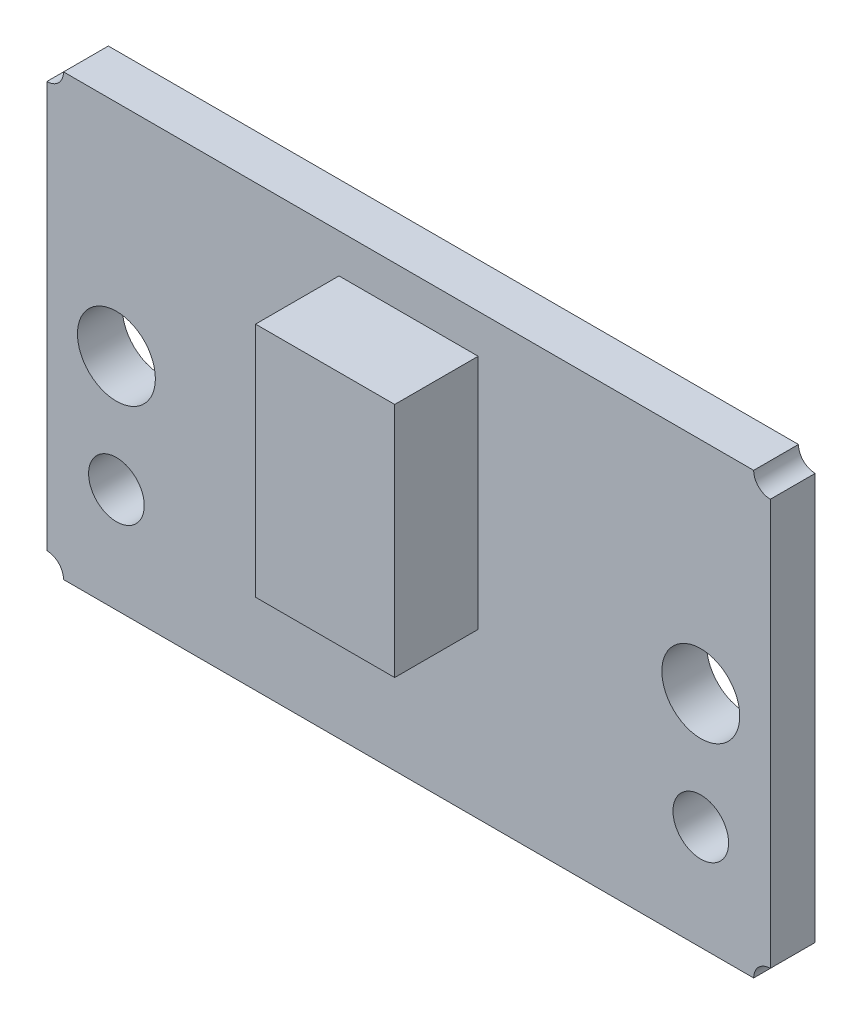
ISO-10303-21;
HEADER;
FILE_DESCRIPTION(('STEP AP214'),'2;1');
FILE_NAME('part.step','',(''),(''),'','','');
FILE_SCHEMA(('AUTOMOTIVE_DESIGN { 1 0 10303 214 1 1 1 1 }'));
ENDSEC;
DATA;
#1=APPLICATION_CONTEXT('core data for automotive mechanical design processes');
#2=APPLICATION_PROTOCOL_DEFINITION('international standard','automotive_design',2000,#1);
#3=PRODUCT_CONTEXT('',#1,'mechanical');
#4=PRODUCT('Part','Part','',(#3));
#5=PRODUCT_RELATED_PRODUCT_CATEGORY('part','',(#4));
#6=PRODUCT_DEFINITION_FORMATION('','',#4);
#7=PRODUCT_DEFINITION_CONTEXT('part definition',#1,'design');
#8=PRODUCT_DEFINITION('design','',#6,#7);
#9=PRODUCT_DEFINITION_SHAPE('','',#8);
#10=(LENGTH_UNIT() NAMED_UNIT(*) SI_UNIT(.MILLI.,.METRE.));
#11=(NAMED_UNIT(*) PLANE_ANGLE_UNIT() SI_UNIT($,.RADIAN.));
#12=(NAMED_UNIT(*) SI_UNIT($,.STERADIAN.) SOLID_ANGLE_UNIT());
#13=UNCERTAINTY_MEASURE_WITH_UNIT(LENGTH_MEASURE(1.E-05),#10,'distance_accuracy_value','');
#14=(GEOMETRIC_REPRESENTATION_CONTEXT(3) GLOBAL_UNCERTAINTY_ASSIGNED_CONTEXT((#13)) GLOBAL_UNIT_ASSIGNED_CONTEXT((#10,
#11,#12)) REPRESENTATION_CONTEXT('',''));
#15=CARTESIAN_POINT('',(0.,0.,0.));
#16=DIRECTION('',(0.,0.,1.));
#17=DIRECTION('',(1.,0.,0.));
#18=AXIS2_PLACEMENT_3D('',#15,#16,#17);
#19=CARTESIAN_POINT('',(0.,0.,1.61));
#20=DIRECTION('',(0.,0.,1.));
#21=DIRECTION('',(1.,0.,0.));
#22=AXIS2_PLACEMENT_3D('',#19,#20,#21);
#23=PLANE('',#22);
#24=CARTESIAN_POINT('',(10.5,0.,1.61));
#25=DIRECTION('',(0.,0.,1.));
#26=DIRECTION('',(1.,0.,0.));
#27=AXIS2_PLACEMENT_3D('',#24,#25,#26);
#28=CIRCLE('',#27,1.4);
#29=CARTESIAN_POINT('',(11.9,0.,1.61));
#30=VERTEX_POINT('',#29);
#31=EDGE_CURVE('E168',#30,#30,#28,.T.);
#32=ORIENTED_EDGE('',*,*,#31,.F.);
#33=EDGE_LOOP('',(#32));
#34=FACE_BOUND('',#33,.T.);
#35=CARTESIAN_POINT('',(-10.5,-4.15,1.61));
#36=DIRECTION('',(0.,0.,1.));
#37=DIRECTION('',(1.,0.,0.));
#38=AXIS2_PLACEMENT_3D('',#35,#36,#37);
#39=CIRCLE('',#38,1.);
#40=CARTESIAN_POINT('',(-9.5,-4.15,1.61));
#41=VERTEX_POINT('',#40);
#42=EDGE_CURVE('E163',#41,#41,#39,.T.);
#43=ORIENTED_EDGE('',*,*,#42,.F.);
#44=EDGE_LOOP('',(#43));
#45=FACE_BOUND('',#44,.T.);
#46=CARTESIAN_POINT('',(10.5,-4.15,1.61));
#47=DIRECTION('',(0.,0.,1.));
#48=DIRECTION('',(1.,0.,0.));
#49=AXIS2_PLACEMENT_3D('',#46,#47,#48);
#50=CIRCLE('',#49,1.);
#51=CARTESIAN_POINT('',(11.5,-4.15,1.61));
#52=VERTEX_POINT('',#51);
#53=EDGE_CURVE('E160',#52,#52,#50,.T.);
#54=ORIENTED_EDGE('',*,*,#53,.F.);
#55=EDGE_LOOP('',(#54));
#56=FACE_BOUND('',#55,.T.);
#57=CARTESIAN_POINT('',(-10.5,0.,1.61));
#58=DIRECTION('',(0.,0.,1.));
#59=DIRECTION('',(1.,0.,0.));
#60=AXIS2_PLACEMENT_3D('',#57,#58,#59);
#61=CIRCLE('',#60,1.4);
#62=CARTESIAN_POINT('',(-9.1,0.,1.61));
#63=VERTEX_POINT('',#62);
#64=EDGE_CURVE('E171',#63,#63,#61,.T.);
#65=ORIENTED_EDGE('',*,*,#64,.F.);
#66=EDGE_LOOP('',(#65));
#67=FACE_BOUND('',#66,.T.);
#68=CARTESIAN_POINT('',(13.,7.9,1.61));
#69=DIRECTION('',(0.,0.,1.));
#70=DIRECTION('',(1.,0.,0.));
#71=AXIS2_PLACEMENT_3D('',#68,#69,#70);
#72=CIRCLE('',#71,0.6);
#73=CARTESIAN_POINT('',(12.4,7.9,1.61));
#74=VERTEX_POINT('',#73);
#75=CARTESIAN_POINT('',(13.,7.3,1.61));
#76=VERTEX_POINT('',#75);
#77=EDGE_CURVE('E188',#74,#76,#72,.T.);
#78=ORIENTED_EDGE('',*,*,#77,.F.);
#79=DIRECTION('',(-1.,0.,0.));
#80=VECTOR('',#79,1.);
#81=CARTESIAN_POINT('',(-13.,7.9,1.61));
#82=LINE('',#81,#80);
#83=CARTESIAN_POINT('',(-12.4,7.9,1.61));
#84=VERTEX_POINT('',#83);
#85=EDGE_CURVE('E220',#74,#84,#82,.T.);
#86=ORIENTED_EDGE('',*,*,#85,.T.);
#87=CARTESIAN_POINT('',(-13.,7.9,1.61));
#88=DIRECTION('',(0.,0.,1.));
#89=DIRECTION('',(1.,0.,0.));
#90=AXIS2_PLACEMENT_3D('',#87,#88,#89);
#91=CIRCLE('',#90,0.6);
#92=CARTESIAN_POINT('',(-13.,7.3,1.61));
#93=VERTEX_POINT('',#92);
#94=EDGE_CURVE('E179',#93,#84,#91,.T.);
#95=ORIENTED_EDGE('',*,*,#94,.F.);
#96=DIRECTION('',(0.,-1.,0.));
#97=VECTOR('',#96,1.);
#98=CARTESIAN_POINT('',(-13.,7.9,1.61));
#99=LINE('',#98,#97);
#100=CARTESIAN_POINT('',(-13.,-7.3,1.61));
#101=VERTEX_POINT('',#100);
#102=EDGE_CURVE('E224',#93,#101,#99,.T.);
#103=ORIENTED_EDGE('',*,*,#102,.T.);
#104=CARTESIAN_POINT('',(-13.,-7.9,1.61));
#105=DIRECTION('',(0.,0.,1.));
#106=DIRECTION('',(1.,0.,0.));
#107=AXIS2_PLACEMENT_3D('',#104,#105,#106);
#108=CIRCLE('',#107,0.6);
#109=CARTESIAN_POINT('',(-12.4,-7.9,1.61));
#110=VERTEX_POINT('',#109);
#111=EDGE_CURVE('E177',#110,#101,#108,.T.);
#112=ORIENTED_EDGE('',*,*,#111,.F.);
#113=DIRECTION('',(1.,0.,0.));
#114=VECTOR('',#113,1.);
#115=CARTESIAN_POINT('',(-13.,-7.9,1.61));
#116=LINE('',#115,#114);
#117=CARTESIAN_POINT('',(12.4,-7.9,1.61));
#118=VERTEX_POINT('',#117);
#119=EDGE_CURVE('E54',#110,#118,#116,.T.);
#120=ORIENTED_EDGE('',*,*,#119,.T.);
#121=CARTESIAN_POINT('',(13.,-7.9,1.61));
#122=DIRECTION('',(0.,0.,1.));
#123=DIRECTION('',(1.,0.,0.));
#124=AXIS2_PLACEMENT_3D('',#121,#122,#123);
#125=CIRCLE('',#124,0.6);
#126=CARTESIAN_POINT('',(13.,-7.3,1.61));
#127=VERTEX_POINT('',#126);
#128=EDGE_CURVE('E183',#127,#118,#125,.T.);
#129=ORIENTED_EDGE('',*,*,#128,.F.);
#130=DIRECTION('',(0.,1.,0.));
#131=VECTOR('',#130,1.);
#132=CARTESIAN_POINT('',(13.,7.9,1.61));
#133=LINE('',#132,#131);
#134=EDGE_CURVE('E217',#127,#76,#133,.T.);
#135=ORIENTED_EDGE('',*,*,#134,.T.);
#136=EDGE_LOOP('',(#78,#86,#95,#103,#112,#120,#129,#135));
#137=FACE_BOUND('',#136,.T.);
#138=DIRECTION('',(-1.,0.,0.));
#139=VECTOR('',#138,1.);
#140=CARTESIAN_POINT('',(-2.5,6.5,1.61));
#141=LINE('',#140,#139);
#142=CARTESIAN_POINT('',(2.5,6.5,1.61));
#143=VERTEX_POINT('',#142);
#144=CARTESIAN_POINT('',(-2.5,6.5,1.61));
#145=VERTEX_POINT('',#144);
#146=EDGE_CURVE('E487',#143,#145,#141,.T.);
#147=ORIENTED_EDGE('',*,*,#146,.F.);
#148=DIRECTION('',(0.,1.,0.));
#149=VECTOR('',#148,1.);
#150=CARTESIAN_POINT('',(2.5,6.5,1.61));
#151=LINE('',#150,#149);
#152=CARTESIAN_POINT('',(2.5,-2.,1.61));
#153=VERTEX_POINT('',#152);
#154=EDGE_CURVE('E158',#153,#143,#151,.T.);
#155=ORIENTED_EDGE('',*,*,#154,.F.);
#156=DIRECTION('',(1.,0.,0.));
#157=VECTOR('',#156,1.);
#158=CARTESIAN_POINT('',(-2.5,-2.,1.61));
#159=LINE('',#158,#157);
#160=CARTESIAN_POINT('',(-2.5,-2.,1.61));
#161=VERTEX_POINT('',#160);
#162=EDGE_CURVE('E154',#161,#153,#159,.T.);
#163=ORIENTED_EDGE('',*,*,#162,.F.);
#164=DIRECTION('',(0.,-1.,0.));
#165=VECTOR('',#164,1.);
#166=CARTESIAN_POINT('',(-2.5,6.5,1.61));
#167=LINE('',#166,#165);
#168=EDGE_CURVE('E484',#145,#161,#167,.T.);
#169=ORIENTED_EDGE('',*,*,#168,.F.);
#170=EDGE_LOOP('',(#147,#155,#163,#169));
#171=FACE_BOUND('',#170,.T.);
#172=ADVANCED_FACE('F45',(#34,#45,#56,#67,#137,#171),#23,.T.);
#173=CARTESIAN_POINT('',(13.,7.9,1.61));
#174=DIRECTION('',(-1.,0.,0.));
#175=DIRECTION('',(0.,-1.,0.));
#176=AXIS2_PLACEMENT_3D('',#173,#174,#175);
#177=PLANE('',#176);
#178=DIRECTION('',(0.,1.,0.));
#179=VECTOR('',#178,1.);
#180=CARTESIAN_POINT('',(13.,7.9,0.));
#181=LINE('',#180,#179);
#182=CARTESIAN_POINT('',(13.,-7.3,0.));
#183=VERTEX_POINT('',#182);
#184=CARTESIAN_POINT('',(13.,7.3,0.));
#185=VERTEX_POINT('',#184);
#186=EDGE_CURVE('E216',#183,#185,#181,.T.);
#187=ORIENTED_EDGE('',*,*,#186,.T.);
#188=DIRECTION('',(0.,0.,1.));
#189=VECTOR('',#188,1.);
#190=CARTESIAN_POINT('',(13.,7.3,0.));
#191=LINE('',#190,#189);
#192=EDGE_CURVE('E213',#185,#76,#191,.T.);
#193=ORIENTED_EDGE('',*,*,#192,.T.);
#194=ORIENTED_EDGE('',*,*,#134,.F.);
#195=DIRECTION('',(0.,0.,1.));
#196=VECTOR('',#195,1.);
#197=CARTESIAN_POINT('',(13.,-7.3,0.));
#198=LINE('',#197,#196);
#199=EDGE_CURVE('E207',#127,#183,#198,.F.);
#200=ORIENTED_EDGE('',*,*,#199,.T.);
#201=EDGE_LOOP('',(#187,#193,#194,#200));
#202=FACE_BOUND('',#201,.T.);
#203=ADVANCED_FACE('F47',(#202),#177,.F.);
#204=CARTESIAN_POINT('',(-13.,7.9,1.61));
#205=DIRECTION('',(0.,-1.,0.));
#206=DIRECTION('',(0.,0.,-1.));
#207=AXIS2_PLACEMENT_3D('',#204,#205,#206);
#208=PLANE('',#207);
#209=ORIENTED_EDGE('',*,*,#85,.F.);
#210=DIRECTION('',(0.,0.,1.));
#211=VECTOR('',#210,1.);
#212=CARTESIAN_POINT('',(12.4,7.9,0.));
#213=LINE('',#212,#211);
#214=CARTESIAN_POINT('',(12.4,7.9,0.));
#215=VERTEX_POINT('',#214);
#216=EDGE_CURVE('E210',#74,#215,#213,.F.);
#217=ORIENTED_EDGE('',*,*,#216,.T.);
#218=DIRECTION('',(-1.,0.,0.));
#219=VECTOR('',#218,1.);
#220=CARTESIAN_POINT('',(-13.,7.9,0.));
#221=LINE('',#220,#219);
#222=CARTESIAN_POINT('',(-12.4,7.9,0.));
#223=VERTEX_POINT('',#222);
#224=EDGE_CURVE('E231',#215,#223,#221,.T.);
#225=ORIENTED_EDGE('',*,*,#224,.T.);
#226=DIRECTION('',(0.,0.,1.));
#227=VECTOR('',#226,1.);
#228=CARTESIAN_POINT('',(-12.4,7.9,0.));
#229=LINE('',#228,#227);
#230=EDGE_CURVE('E70',#223,#84,#229,.T.);
#231=ORIENTED_EDGE('',*,*,#230,.T.);
#232=EDGE_LOOP('',(#209,#217,#225,#231));
#233=FACE_BOUND('',#232,.T.);
#234=ADVANCED_FACE('F273',(#233),#208,.F.);
#235=CARTESIAN_POINT('',(-13.,7.9,1.61));
#236=DIRECTION('',(1.,0.,0.));
#237=DIRECTION('',(0.,1.,0.));
#238=AXIS2_PLACEMENT_3D('',#235,#236,#237);
#239=PLANE('',#238);
#240=DIRECTION('',(0.,-1.,0.));
#241=VECTOR('',#240,1.);
#242=CARTESIAN_POINT('',(-13.,7.9,0.));
#243=LINE('',#242,#241);
#244=CARTESIAN_POINT('',(-13.,7.3,0.));
#245=VERTEX_POINT('',#244);
#246=CARTESIAN_POINT('',(-13.,-7.3,0.));
#247=VERTEX_POINT('',#246);
#248=EDGE_CURVE('E234',#245,#247,#243,.T.);
#249=ORIENTED_EDGE('',*,*,#248,.T.);
#250=DIRECTION('',(0.,0.,1.));
#251=VECTOR('',#250,1.);
#252=CARTESIAN_POINT('',(-13.,-7.3,0.));
#253=LINE('',#252,#251);
#254=EDGE_CURVE('E201',#247,#101,#253,.T.);
#255=ORIENTED_EDGE('',*,*,#254,.T.);
#256=ORIENTED_EDGE('',*,*,#102,.F.);
#257=DIRECTION('',(0.,0.,1.));
#258=VECTOR('',#257,1.);
#259=CARTESIAN_POINT('',(-13.,7.3,0.));
#260=LINE('',#259,#258);
#261=EDGE_CURVE('E194',#93,#245,#260,.F.);
#262=ORIENTED_EDGE('',*,*,#261,.T.);
#263=EDGE_LOOP('',(#249,#255,#256,#262));
#264=FACE_BOUND('',#263,.T.);
#265=ADVANCED_FACE('F286',(#264),#239,.F.);
#266=CARTESIAN_POINT('',(-13.,-7.9,1.61));
#267=DIRECTION('',(0.,1.,0.));
#268=DIRECTION('',(0.,0.,1.));
#269=AXIS2_PLACEMENT_3D('',#266,#267,#268);
#270=PLANE('',#269);
#271=DIRECTION('',(1.,0.,0.));
#272=VECTOR('',#271,1.);
#273=CARTESIAN_POINT('',(-13.,-7.9,0.));
#274=LINE('',#273,#272);
#275=CARTESIAN_POINT('',(-12.4,-7.9,0.));
#276=VERTEX_POINT('',#275);
#277=CARTESIAN_POINT('',(12.4,-7.9,0.));
#278=VERTEX_POINT('',#277);
#279=EDGE_CURVE('E221',#276,#278,#274,.T.);
#280=ORIENTED_EDGE('',*,*,#279,.T.);
#281=DIRECTION('',(0.,0.,1.));
#282=VECTOR('',#281,1.);
#283=CARTESIAN_POINT('',(12.4,-7.9,0.));
#284=LINE('',#283,#282);
#285=EDGE_CURVE('E204',#278,#118,#284,.T.);
#286=ORIENTED_EDGE('',*,*,#285,.T.);
#287=ORIENTED_EDGE('',*,*,#119,.F.);
#288=DIRECTION('',(0.,0.,1.));
#289=VECTOR('',#288,1.);
#290=CARTESIAN_POINT('',(-12.4,-7.9,0.));
#291=LINE('',#290,#289);
#292=EDGE_CURVE('E198',#110,#276,#291,.F.);
#293=ORIENTED_EDGE('',*,*,#292,.T.);
#294=EDGE_LOOP('',(#280,#286,#287,#293));
#295=FACE_BOUND('',#294,.T.);
#296=ADVANCED_FACE('F283',(#295),#270,.F.);
#297=CARTESIAN_POINT('',(0.,0.,0.));
#298=DIRECTION('',(0.,0.,1.));
#299=DIRECTION('',(1.,0.,0.));
#300=AXIS2_PLACEMENT_3D('',#297,#298,#299);
#301=PLANE('',#300);
#302=CARTESIAN_POINT('',(10.5,0.,0.));
#303=DIRECTION('',(0.,0.,1.));
#304=DIRECTION('',(1.,0.,0.));
#305=AXIS2_PLACEMENT_3D('',#302,#303,#304);
#306=CIRCLE('',#305,1.4);
#307=CARTESIAN_POINT('',(11.9,0.,0.));
#308=VERTEX_POINT('',#307);
#309=EDGE_CURVE('E49',#308,#308,#306,.T.);
#310=ORIENTED_EDGE('',*,*,#309,.T.);
#311=EDGE_LOOP('',(#310));
#312=FACE_BOUND('',#311,.T.);
#313=CARTESIAN_POINT('',(-10.5,-4.15,0.));
#314=DIRECTION('',(0.,0.,1.));
#315=DIRECTION('',(1.,0.,0.));
#316=AXIS2_PLACEMENT_3D('',#313,#314,#315);
#317=CIRCLE('',#316,1.);
#318=CARTESIAN_POINT('',(-9.5,-4.15,0.));
#319=VERTEX_POINT('',#318);
#320=EDGE_CURVE('E243',#319,#319,#317,.T.);
#321=ORIENTED_EDGE('',*,*,#320,.T.);
#322=EDGE_LOOP('',(#321));
#323=FACE_BOUND('',#322,.T.);
#324=CARTESIAN_POINT('',(10.5,-4.15,0.));
#325=DIRECTION('',(0.,0.,1.));
#326=DIRECTION('',(1.,0.,0.));
#327=AXIS2_PLACEMENT_3D('',#324,#325,#326);
#328=CIRCLE('',#327,1.);
#329=CARTESIAN_POINT('',(11.5,-4.15,0.));
#330=VERTEX_POINT('',#329);
#331=EDGE_CURVE('E241',#330,#330,#328,.T.);
#332=ORIENTED_EDGE('',*,*,#331,.T.);
#333=EDGE_LOOP('',(#332));
#334=FACE_BOUND('',#333,.T.);
#335=CARTESIAN_POINT('',(-10.5,0.,0.));
#336=DIRECTION('',(0.,0.,1.));
#337=DIRECTION('',(1.,0.,0.));
#338=AXIS2_PLACEMENT_3D('',#335,#336,#337);
#339=CIRCLE('',#338,1.4);
#340=CARTESIAN_POINT('',(-9.1,0.,0.));
#341=VERTEX_POINT('',#340);
#342=EDGE_CURVE('E176',#341,#341,#339,.T.);
#343=ORIENTED_EDGE('',*,*,#342,.T.);
#344=EDGE_LOOP('',(#343));
#345=FACE_BOUND('',#344,.T.);
#346=ORIENTED_EDGE('',*,*,#224,.F.);
#347=CARTESIAN_POINT('',(13.,7.9,0.));
#348=DIRECTION('',(0.,0.,1.));
#349=DIRECTION('',(1.,0.,0.));
#350=AXIS2_PLACEMENT_3D('',#347,#348,#349);
#351=CIRCLE('',#350,0.6);
#352=EDGE_CURVE('E190',#215,#185,#351,.T.);
#353=ORIENTED_EDGE('',*,*,#352,.T.);
#354=ORIENTED_EDGE('',*,*,#186,.F.);
#355=CARTESIAN_POINT('',(13.,-7.9,0.));
#356=DIRECTION('',(0.,0.,1.));
#357=DIRECTION('',(1.,0.,0.));
#358=AXIS2_PLACEMENT_3D('',#355,#356,#357);
#359=CIRCLE('',#358,0.6);
#360=EDGE_CURVE('E185',#183,#278,#359,.T.);
#361=ORIENTED_EDGE('',*,*,#360,.T.);
#362=ORIENTED_EDGE('',*,*,#279,.F.);
#363=CARTESIAN_POINT('',(-13.,-7.9,0.));
#364=DIRECTION('',(0.,0.,1.));
#365=DIRECTION('',(1.,0.,0.));
#366=AXIS2_PLACEMENT_3D('',#363,#364,#365);
#367=CIRCLE('',#366,0.6);
#368=EDGE_CURVE('E180',#276,#247,#367,.T.);
#369=ORIENTED_EDGE('',*,*,#368,.T.);
#370=ORIENTED_EDGE('',*,*,#248,.F.);
#371=CARTESIAN_POINT('',(-13.,7.9,0.));
#372=DIRECTION('',(0.,0.,1.));
#373=DIRECTION('',(1.,0.,0.));
#374=AXIS2_PLACEMENT_3D('',#371,#372,#373);
#375=CIRCLE('',#374,0.6);
#376=EDGE_CURVE('E11',#245,#223,#375,.T.);
#377=ORIENTED_EDGE('',*,*,#376,.T.);
#378=EDGE_LOOP('',(#346,#353,#354,#361,#362,#369,#370,#377));
#379=FACE_BOUND('',#378,.T.);
#380=ADVANCED_FACE('F250',(#312,#323,#334,#345,#379),#301,.F.);
#381=CARTESIAN_POINT('',(-13.,7.9,0.));
#382=DIRECTION('',(0.,0.,1.));
#383=DIRECTION('',(1.,0.,0.));
#384=AXIS2_PLACEMENT_3D('',#381,#382,#383);
#385=CYLINDRICAL_SURFACE('',#384,0.6);
#386=ORIENTED_EDGE('',*,*,#376,.F.);
#387=ORIENTED_EDGE('',*,*,#261,.F.);
#388=ORIENTED_EDGE('',*,*,#94,.T.);
#389=ORIENTED_EDGE('',*,*,#230,.F.);
#390=EDGE_LOOP('',(#386,#387,#388,#389));
#391=FACE_BOUND('',#390,.T.);
#392=ADVANCED_FACE('F279',(#391),#385,.F.);
#393=CARTESIAN_POINT('',(-13.,-7.9,0.));
#394=DIRECTION('',(0.,0.,1.));
#395=DIRECTION('',(1.,0.,0.));
#396=AXIS2_PLACEMENT_3D('',#393,#394,#395);
#397=CYLINDRICAL_SURFACE('',#396,0.6);
#398=ORIENTED_EDGE('',*,*,#368,.F.);
#399=ORIENTED_EDGE('',*,*,#292,.F.);
#400=ORIENTED_EDGE('',*,*,#111,.T.);
#401=ORIENTED_EDGE('',*,*,#254,.F.);
#402=EDGE_LOOP('',(#398,#399,#400,#401));
#403=FACE_BOUND('',#402,.T.);
#404=ADVANCED_FACE('F315',(#403),#397,.F.);
#405=CARTESIAN_POINT('',(13.,-7.9,0.));
#406=DIRECTION('',(0.,0.,1.));
#407=DIRECTION('',(1.,0.,0.));
#408=AXIS2_PLACEMENT_3D('',#405,#406,#407);
#409=CYLINDRICAL_SURFACE('',#408,0.6);
#410=ORIENTED_EDGE('',*,*,#128,.T.);
#411=ORIENTED_EDGE('',*,*,#285,.F.);
#412=ORIENTED_EDGE('',*,*,#360,.F.);
#413=ORIENTED_EDGE('',*,*,#199,.F.);
#414=EDGE_LOOP('',(#410,#411,#412,#413));
#415=FACE_BOUND('',#414,.T.);
#416=ADVANCED_FACE('F313',(#415),#409,.F.);
#417=CARTESIAN_POINT('',(13.,7.9,0.));
#418=DIRECTION('',(0.,0.,1.));
#419=DIRECTION('',(1.,0.,0.));
#420=AXIS2_PLACEMENT_3D('',#417,#418,#419);
#421=CYLINDRICAL_SURFACE('',#420,0.6);
#422=ORIENTED_EDGE('',*,*,#352,.F.);
#423=ORIENTED_EDGE('',*,*,#216,.F.);
#424=ORIENTED_EDGE('',*,*,#77,.T.);
#425=ORIENTED_EDGE('',*,*,#192,.F.);
#426=EDGE_LOOP('',(#422,#423,#424,#425));
#427=FACE_BOUND('',#426,.T.);
#428=ADVANCED_FACE('F304',(#427),#421,.F.);
#429=CARTESIAN_POINT('',(-10.5,0.,-10.));
#430=DIRECTION('',(0.,0.,1.));
#431=DIRECTION('',(1.,0.,0.));
#432=AXIS2_PLACEMENT_3D('',#429,#430,#431);
#433=CYLINDRICAL_SURFACE('',#432,1.4);
#434=ORIENTED_EDGE('',*,*,#64,.T.);
#435=EDGE_LOOP('',(#434));
#436=FACE_BOUND('',#435,.T.);
#437=ORIENTED_EDGE('',*,*,#342,.F.);
#438=EDGE_LOOP('',(#437));
#439=FACE_BOUND('',#438,.T.);
#440=ADVANCED_FACE('F321',(#436,#439),#433,.F.);
#441=CARTESIAN_POINT('',(10.5,-4.15,-10.));
#442=DIRECTION('',(0.,0.,1.));
#443=DIRECTION('',(1.,0.,0.));
#444=AXIS2_PLACEMENT_3D('',#441,#442,#443);
#445=CYLINDRICAL_SURFACE('',#444,1.);
#446=ORIENTED_EDGE('',*,*,#53,.T.);
#447=EDGE_LOOP('',(#446));
#448=FACE_BOUND('',#447,.T.);
#449=ORIENTED_EDGE('',*,*,#331,.F.);
#450=EDGE_LOOP('',(#449));
#451=FACE_BOUND('',#450,.T.);
#452=ADVANCED_FACE('F263',(#448,#451),#445,.F.);
#453=CARTESIAN_POINT('',(-10.5,-4.15,-10.));
#454=DIRECTION('',(0.,0.,1.));
#455=DIRECTION('',(1.,0.,0.));
#456=AXIS2_PLACEMENT_3D('',#453,#454,#455);
#457=CYLINDRICAL_SURFACE('',#456,1.);
#458=ORIENTED_EDGE('',*,*,#42,.T.);
#459=EDGE_LOOP('',(#458));
#460=FACE_BOUND('',#459,.T.);
#461=ORIENTED_EDGE('',*,*,#320,.F.);
#462=EDGE_LOOP('',(#461));
#463=FACE_BOUND('',#462,.T.);
#464=ADVANCED_FACE('F254',(#460,#463),#457,.F.);
#465=CARTESIAN_POINT('',(10.5,0.,-10.));
#466=DIRECTION('',(0.,0.,1.));
#467=DIRECTION('',(1.,0.,0.));
#468=AXIS2_PLACEMENT_3D('',#465,#466,#467);
#469=CYLINDRICAL_SURFACE('',#468,1.4);
#470=ORIENTED_EDGE('',*,*,#31,.T.);
#471=EDGE_LOOP('',(#470));
#472=FACE_BOUND('',#471,.T.);
#473=ORIENTED_EDGE('',*,*,#309,.F.);
#474=EDGE_LOOP('',(#473));
#475=FACE_BOUND('',#474,.T.);
#476=ADVANCED_FACE('F252',(#472,#475),#469,.F.);
#477=CARTESIAN_POINT('',(2.5,6.5,4.61));
#478=DIRECTION('',(-1.,0.,0.));
#479=DIRECTION('',(0.,-1.,0.));
#480=AXIS2_PLACEMENT_3D('',#477,#478,#479);
#481=PLANE('',#480);
#482=ORIENTED_EDGE('',*,*,#154,.T.);
#483=DIRECTION('',(0.,0.,-1.));
#484=VECTOR('',#483,1.);
#485=CARTESIAN_POINT('',(2.5,6.5,4.61));
#486=LINE('',#485,#484);
#487=CARTESIAN_POINT('',(2.5,6.5,4.61));
#488=VERTEX_POINT('',#487);
#489=EDGE_CURVE('E139',#488,#143,#486,.T.);
#490=ORIENTED_EDGE('',*,*,#489,.F.);
#491=DIRECTION('',(0.,1.,0.));
#492=VECTOR('',#491,1.);
#493=CARTESIAN_POINT('',(2.5,6.5,4.61));
#494=LINE('',#493,#492);
#495=CARTESIAN_POINT('',(2.5,-2.,4.61));
#496=VERTEX_POINT('',#495);
#497=EDGE_CURVE('E146',#496,#488,#494,.T.);
#498=ORIENTED_EDGE('',*,*,#497,.F.);
#499=DIRECTION('',(0.,0.,-1.));
#500=VECTOR('',#499,1.);
#501=CARTESIAN_POINT('',(2.5,-2.,4.61));
#502=LINE('',#501,#500);
#503=EDGE_CURVE('E482',#496,#153,#502,.T.);
#504=ORIENTED_EDGE('',*,*,#503,.T.);
#505=EDGE_LOOP('',(#482,#490,#498,#504));
#506=FACE_BOUND('',#505,.T.);
#507=ADVANCED_FACE('F156',(#506),#481,.F.);
#508=CARTESIAN_POINT('',(-2.5,6.5,4.61));
#509=DIRECTION('',(0.,-1.,0.));
#510=DIRECTION('',(0.,0.,-1.));
#511=AXIS2_PLACEMENT_3D('',#508,#509,#510);
#512=PLANE('',#511);
#513=ORIENTED_EDGE('',*,*,#146,.T.);
#514=DIRECTION('',(0.,0.,-1.));
#515=VECTOR('',#514,1.);
#516=CARTESIAN_POINT('',(-2.5,6.5,4.61));
#517=LINE('',#516,#515);
#518=CARTESIAN_POINT('',(-2.5,6.5,4.61));
#519=VERTEX_POINT('',#518);
#520=EDGE_CURVE('E142',#519,#145,#517,.T.);
#521=ORIENTED_EDGE('',*,*,#520,.F.);
#522=DIRECTION('',(-1.,0.,0.));
#523=VECTOR('',#522,1.);
#524=CARTESIAN_POINT('',(-2.5,6.5,4.61));
#525=LINE('',#524,#523);
#526=EDGE_CURVE('E135',#488,#519,#525,.T.);
#527=ORIENTED_EDGE('',*,*,#526,.F.);
#528=ORIENTED_EDGE('',*,*,#489,.T.);
#529=EDGE_LOOP('',(#513,#521,#527,#528));
#530=FACE_BOUND('',#529,.T.);
#531=ADVANCED_FACE('F137',(#530),#512,.F.);
#532=CARTESIAN_POINT('',(-2.5,6.5,4.61));
#533=DIRECTION('',(1.,0.,0.));
#534=DIRECTION('',(0.,1.,0.));
#535=AXIS2_PLACEMENT_3D('',#532,#533,#534);
#536=PLANE('',#535);
#537=ORIENTED_EDGE('',*,*,#168,.T.);
#538=DIRECTION('',(0.,0.,-1.));
#539=VECTOR('',#538,1.);
#540=CARTESIAN_POINT('',(-2.5,-2.,4.61));
#541=LINE('',#540,#539);
#542=CARTESIAN_POINT('',(-2.5,-2.,4.61));
#543=VERTEX_POINT('',#542);
#544=EDGE_CURVE('E62',#543,#161,#541,.T.);
#545=ORIENTED_EDGE('',*,*,#544,.F.);
#546=DIRECTION('',(0.,-1.,0.));
#547=VECTOR('',#546,1.);
#548=CARTESIAN_POINT('',(-2.5,6.5,4.61));
#549=LINE('',#548,#547);
#550=EDGE_CURVE('E145',#519,#543,#549,.T.);
#551=ORIENTED_EDGE('',*,*,#550,.F.);
#552=ORIENTED_EDGE('',*,*,#520,.T.);
#553=EDGE_LOOP('',(#537,#545,#551,#552));
#554=FACE_BOUND('',#553,.T.);
#555=ADVANCED_FACE('F341',(#554),#536,.F.);
#556=CARTESIAN_POINT('',(-2.5,-2.,4.61));
#557=DIRECTION('',(0.,1.,0.));
#558=DIRECTION('',(0.,0.,1.));
#559=AXIS2_PLACEMENT_3D('',#556,#557,#558);
#560=PLANE('',#559);
#561=ORIENTED_EDGE('',*,*,#162,.T.);
#562=ORIENTED_EDGE('',*,*,#503,.F.);
#563=DIRECTION('',(1.,0.,0.));
#564=VECTOR('',#563,1.);
#565=CARTESIAN_POINT('',(-2.5,-2.,4.61));
#566=LINE('',#565,#564);
#567=EDGE_CURVE('E150',#543,#496,#566,.T.);
#568=ORIENTED_EDGE('',*,*,#567,.F.);
#569=ORIENTED_EDGE('',*,*,#544,.T.);
#570=EDGE_LOOP('',(#561,#562,#568,#569));
#571=FACE_BOUND('',#570,.T.);
#572=ADVANCED_FACE('F344',(#571),#560,.F.);
#573=CARTESIAN_POINT('',(0.,0.,4.61));
#574=DIRECTION('',(0.,0.,1.));
#575=DIRECTION('',(1.,0.,0.));
#576=AXIS2_PLACEMENT_3D('',#573,#574,#575);
#577=PLANE('',#576);
#578=ORIENTED_EDGE('',*,*,#497,.T.);
#579=ORIENTED_EDGE('',*,*,#526,.T.);
#580=ORIENTED_EDGE('',*,*,#550,.T.);
#581=ORIENTED_EDGE('',*,*,#567,.T.);
#582=EDGE_LOOP('',(#578,#579,#580,#581));
#583=FACE_BOUND('',#582,.T.);
#584=ADVANCED_FACE('F149',(#583),#577,.T.);
#585=CLOSED_SHELL('',(#172,#203,#234,#265,#296,#380,#392,#404,#416,#428,#440,#452,#464,#476,
#507,#531,#555,#572,#584));
#586=MANIFOLD_SOLID_BREP('B2',#585);
#587=ADVANCED_BREP_SHAPE_REPRESENTATION('',(#18,#586),#14);
#588=SHAPE_DEFINITION_REPRESENTATION(#9,#587);
ENDSEC;
END-ISO-10303-21;
